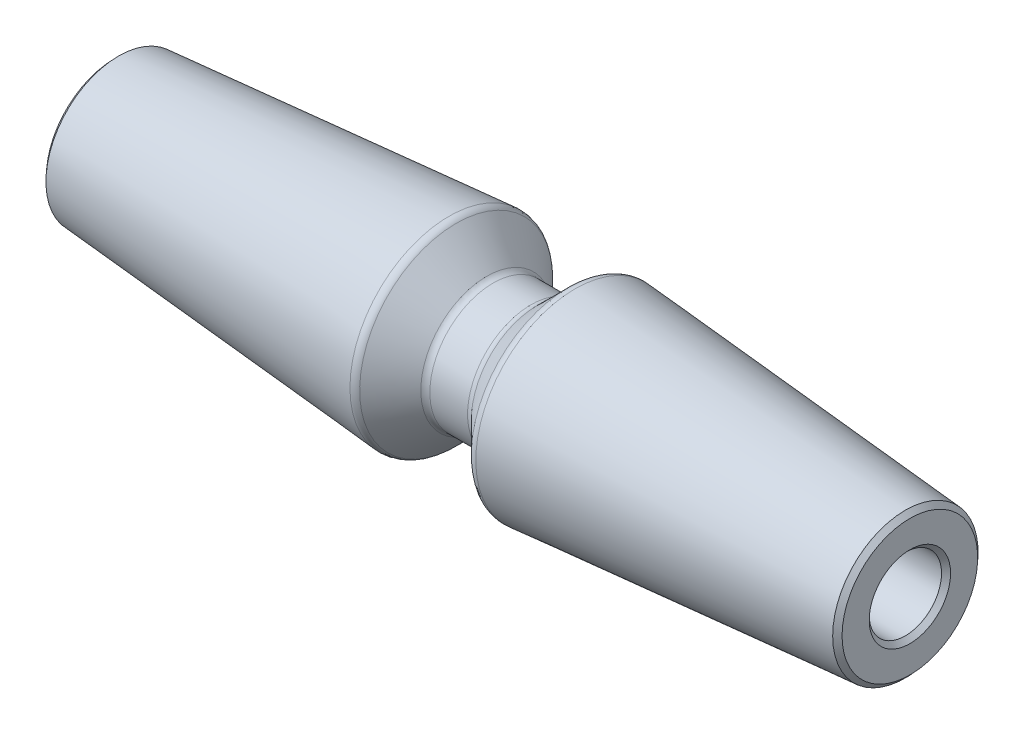
ISO-10303-21;
HEADER;
FILE_DESCRIPTION(('STEP AP214'),'2;1');
FILE_NAME('part.step','',(''),(''),'','','');
FILE_SCHEMA(('AUTOMOTIVE_DESIGN { 1 0 10303 214 1 1 1 1 }'));
ENDSEC;
DATA;
#1=APPLICATION_CONTEXT('core data for automotive mechanical design processes');
#2=APPLICATION_PROTOCOL_DEFINITION('international standard','automotive_design',2000,#1);
#3=PRODUCT_CONTEXT('',#1,'mechanical');
#4=PRODUCT('Part','Part','',(#3));
#5=PRODUCT_RELATED_PRODUCT_CATEGORY('part','',(#4));
#6=PRODUCT_DEFINITION_FORMATION('','',#4);
#7=PRODUCT_DEFINITION_CONTEXT('part definition',#1,'design');
#8=PRODUCT_DEFINITION('design','',#6,#7);
#9=PRODUCT_DEFINITION_SHAPE('','',#8);
#10=(LENGTH_UNIT() NAMED_UNIT(*) SI_UNIT(.MILLI.,.METRE.));
#11=(NAMED_UNIT(*) PLANE_ANGLE_UNIT() SI_UNIT($,.RADIAN.));
#12=(NAMED_UNIT(*) SI_UNIT($,.STERADIAN.) SOLID_ANGLE_UNIT());
#13=UNCERTAINTY_MEASURE_WITH_UNIT(LENGTH_MEASURE(1.E-05),#10,'distance_accuracy_value','');
#14=(GEOMETRIC_REPRESENTATION_CONTEXT(3) GLOBAL_UNCERTAINTY_ASSIGNED_CONTEXT((#13)) GLOBAL_UNIT_ASSIGNED_CONTEXT((#10,
#11,#12)) REPRESENTATION_CONTEXT('',''));
#15=CARTESIAN_POINT('',(0.,0.,0.));
#16=DIRECTION('',(0.,0.,1.));
#17=DIRECTION('',(1.,0.,0.));
#18=AXIS2_PLACEMENT_3D('',#15,#16,#17);
#19=CARTESIAN_POINT('',(-13.,6.,0.));
#20=DIRECTION('',(-1.,0.,0.));
#21=DIRECTION('',(0.,0.,1.));
#22=AXIS2_PLACEMENT_3D('',#19,#20,#21);
#23=PLANE('',#22);
#24=CARTESIAN_POINT('',(-13.0000000002042,0.,0.));
#25=DIRECTION('',(-1.,0.,0.));
#26=DIRECTION('',(0.,0.,1.));
#27=AXIS2_PLACEMENT_3D('',#24,#25,#26);
#28=CIRCLE('',#27,4.49999999972306);
#29=CARTESIAN_POINT('',(-13.0000000002042,0.,4.49999999972306));
#30=VERTEX_POINT('',#29);
#31=EDGE_CURVE('E132',#30,#30,#28,.F.);
#32=ORIENTED_EDGE('',*,*,#31,.T.);
#33=EDGE_LOOP('',(#32));
#34=FACE_BOUND('',#33,.T.);
#35=CARTESIAN_POINT('',(-13.0000000002546,0.,0.));
#36=DIRECTION('',(1.,0.,0.));
#37=DIRECTION('',(0.,1.,0.));
#38=AXIS2_PLACEMENT_3D('',#35,#36,#37);
#39=CIRCLE('',#38,7.50000000023502);
#40=CARTESIAN_POINT('',(-13.0000000002546,7.50000000023502,0.));
#41=VERTEX_POINT('',#40);
#42=EDGE_CURVE('E18',#41,#41,#39,.T.);
#43=ORIENTED_EDGE('',*,*,#42,.F.);
#44=EDGE_LOOP('',(#43));
#45=FACE_BOUND('',#44,.T.);
#46=ADVANCED_FACE('F15',(#34,#45),#23,.T.);
#47=CARTESIAN_POINT('',(-12.5015923604774,0.,0.));
#48=DIRECTION('',(1.,0.,0.));
#49=DIRECTION('',(0.,1.,0.));
#50=AXIS2_PLACEMENT_3D('',#47,#48,#49);
#51=CONICAL_SURFACE('',#50,8.03987261090644,0.825313155310512);
#52=CARTESIAN_POINT('',(-12.5015923608634,0.,0.));
#53=DIRECTION('',(1.,0.,0.));
#54=DIRECTION('',(0.,1.,0.));
#55=AXIS2_PLACEMENT_3D('',#52,#53,#54);
#56=CIRCLE('',#55,8.03987261278535);
#57=CARTESIAN_POINT('',(-12.5015923608634,8.03987261278534,0.));
#58=VERTEX_POINT('',#57);
#59=EDGE_CURVE('E127',#58,#58,#56,.T.);
#60=ORIENTED_EDGE('',*,*,#59,.F.);
#61=EDGE_LOOP('',(#60));
#62=FACE_BOUND('',#61,.T.);
#63=ORIENTED_EDGE('',*,*,#42,.T.);
#64=EDGE_LOOP('',(#63));
#65=FACE_BOUND('',#64,.T.);
#66=ADVANCED_FACE('F156',(#62,#65),#51,.T.);
#67=CARTESIAN_POINT('',(-13.0000000001473,0.,0.));
#68=DIRECTION('',(-1.,0.,0.));
#69=DIRECTION('',(0.,0.,1.));
#70=AXIS2_PLACEMENT_3D('',#67,#68,#69);
#71=CONICAL_SURFACE('',#70,4.49999999966621,0.785398162487954);
#72=ORIENTED_EDGE('',*,*,#31,.F.);
#73=EDGE_LOOP('',(#72));
#74=FACE_BOUND('',#73,.T.);
#75=CARTESIAN_POINT('',(-12.5,0.,0.));
#76=DIRECTION('',(1.,0.,0.));
#77=DIRECTION('',(0.,1.,0.));
#78=AXIS2_PLACEMENT_3D('',#75,#76,#77);
#79=CIRCLE('',#78,4.);
#80=CARTESIAN_POINT('',(-12.5,4.,0.));
#81=VERTEX_POINT('',#80);
#82=EDGE_CURVE('E122',#81,#81,#79,.T.);
#83=ORIENTED_EDGE('',*,*,#82,.T.);
#84=EDGE_LOOP('',(#83));
#85=FACE_BOUND('',#84,.T.);
#86=ADVANCED_FACE('F163',(#74,#85),#71,.F.);
#87=CARTESIAN_POINT('',(24.0396819389131,0.,0.));
#88=DIRECTION('',(1.,0.,0.));
#89=DIRECTION('',(0.,0.,-1.));
#90=AXIS2_PLACEMENT_3D('',#87,#88,#89);
#91=CONICAL_SURFACE('',#90,10.9631745534129,0.0798299856210183);
#92=ORIENTED_EDGE('',*,*,#59,.T.);
#93=EDGE_LOOP('',(#92));
#94=FACE_BOUND('',#93,.T.);
#95=CARTESIAN_POINT('',(24.0396819387779,0.,0.));
#96=DIRECTION('',(1.,0.,0.));
#97=DIRECTION('',(0.,0.,-1.));
#98=AXIS2_PLACEMENT_3D('',#95,#96,#97);
#99=CIRCLE('',#98,10.9631745551022);
#100=CARTESIAN_POINT('',(24.0396819387779,0.,-10.9631745551022));
#101=VERTEX_POINT('',#100);
#102=EDGE_CURVE('E118',#101,#101,#99,.T.);
#103=ORIENTED_EDGE('',*,*,#102,.F.);
#104=EDGE_LOOP('',(#103));
#105=FACE_BOUND('',#104,.T.);
#106=ADVANCED_FACE('F246',(#94,#105),#91,.T.);
#107=CARTESIAN_POINT('',(-8.,0.,0.));
#108=DIRECTION('',(1.,0.,0.));
#109=DIRECTION('',(0.,1.,0.));
#110=AXIS2_PLACEMENT_3D('',#107,#108,#109);
#111=CYLINDRICAL_SURFACE('',#110,4.);
#112=ORIENTED_EDGE('',*,*,#82,.F.);
#113=EDGE_LOOP('',(#112));
#114=FACE_BOUND('',#113,.T.);
#115=CARTESIAN_POINT('',(-3.,0.,0.));
#116=DIRECTION('',(1.,0.,0.));
#117=DIRECTION('',(0.,1.,0.));
#118=AXIS2_PLACEMENT_3D('',#115,#116,#117);
#119=CIRCLE('',#118,4.);
#120=CARTESIAN_POINT('',(-3.,4.,0.));
#121=VERTEX_POINT('',#120);
#122=EDGE_CURVE('E121',#121,#121,#119,.F.);
#123=ORIENTED_EDGE('',*,*,#122,.F.);
#124=EDGE_LOOP('',(#123));
#125=FACE_BOUND('',#124,.T.);
#126=ADVANCED_FACE('F110',(#114,#125),#111,.F.);
#127=CARTESIAN_POINT('',(24.1194271610608,0.,0.));
#128=DIRECTION('',(1.,0.,0.));
#129=DIRECTION('',(0.,0.,-1.));
#130=AXIS2_PLACEMENT_3D('',#127,#128,#129);
#131=TOROIDAL_SURFACE('',#130,9.96635927656611,1.);
#132=ORIENTED_EDGE('',*,*,#102,.T.);
#133=EDGE_LOOP('',(#132));
#134=FACE_BOUND('',#133,.T.);
#135=CARTESIAN_POINT('',(24.8265339407304,0.,0.));
#136=DIRECTION('',(-1.,0.,0.));
#137=DIRECTION('',(0.,1.,0.));
#138=AXIS2_PLACEMENT_3D('',#135,#136,#137);
#139=CIRCLE('',#138,10.6734660562357);
#140=CARTESIAN_POINT('',(24.8265339407304,10.6734660562357,0.));
#141=VERTEX_POINT('',#140);
#142=EDGE_CURVE('E148',#141,#141,#139,.F.);
#143=ORIENTED_EDGE('',*,*,#142,.F.);
#144=EDGE_LOOP('',(#143));
#145=FACE_BOUND('',#144,.T.);
#146=ADVANCED_FACE('F105',(#134,#145),#131,.T.);
#147=CARTESIAN_POINT('',(-3.,3.75,0.));
#148=DIRECTION('',(-1.,0.,0.));
#149=DIRECTION('',(0.,0.,1.));
#150=AXIS2_PLACEMENT_3D('',#147,#148,#149);
#151=PLANE('',#150);
#152=CARTESIAN_POINT('',(-3.,0.,0.));
#153=DIRECTION('',(1.,0.,0.));
#154=DIRECTION('',(0.,1.,0.));
#155=AXIS2_PLACEMENT_3D('',#152,#153,#154);
#156=CIRCLE('',#155,3.5);
#157=CARTESIAN_POINT('',(-3.,3.5,0.));
#158=VERTEX_POINT('',#157);
#159=EDGE_CURVE('E145',#158,#158,#156,.T.);
#160=ORIENTED_EDGE('',*,*,#159,.T.);
#161=EDGE_LOOP('',(#160));
#162=FACE_BOUND('',#161,.T.);
#163=ORIENTED_EDGE('',*,*,#122,.T.);
#164=EDGE_LOOP('',(#163));
#165=FACE_BOUND('',#164,.T.);
#166=ADVANCED_FACE('F101',(#162,#165),#151,.T.);
#167=CARTESIAN_POINT('',(24.8265339407304,0.,0.));
#168=DIRECTION('',(-1.,0.,0.));
#169=DIRECTION('',(0.,0.,1.));
#170=AXIS2_PLACEMENT_3D('',#167,#168,#169);
#171=CONICAL_SURFACE('',#170,10.6734660562357,0.785398162500001);
#172=ORIENTED_EDGE('',*,*,#142,.T.);
#173=EDGE_LOOP('',(#172));
#174=FACE_BOUND('',#173,.T.);
#175=CARTESIAN_POINT('',(28.2071067811865,0.,0.));
#176=DIRECTION('',(1.,0.,0.));
#177=DIRECTION('',(0.,0.,-1.));
#178=AXIS2_PLACEMENT_3D('',#175,#176,#177);
#179=CIRCLE('',#178,7.29289321881346);
#180=CARTESIAN_POINT('',(28.2071067811865,0.,-7.29289321881346));
#181=VERTEX_POINT('',#180);
#182=EDGE_CURVE('E85',#181,#181,#179,.F.);
#183=ORIENTED_EDGE('',*,*,#182,.T.);
#184=EDGE_LOOP('',(#183));
#185=FACE_BOUND('',#184,.T.);
#186=ADVANCED_FACE('F97',(#174,#185),#171,.T.);
#187=CARTESIAN_POINT('',(31.,0.,0.));
#188=DIRECTION('',(1.,0.,0.));
#189=DIRECTION('',(0.,1.,0.));
#190=AXIS2_PLACEMENT_3D('',#187,#188,#189);
#191=CYLINDRICAL_SURFACE('',#190,3.5);
#192=CARTESIAN_POINT('',(65.,0.,0.));
#193=DIRECTION('',(1.,0.,0.));
#194=DIRECTION('',(0.,1.,0.));
#195=AXIS2_PLACEMENT_3D('',#192,#193,#194);
#196=CIRCLE('',#195,3.5);
#197=CARTESIAN_POINT('',(65.,3.5,0.));
#198=VERTEX_POINT('',#197);
#199=EDGE_CURVE('E80',#198,#198,#196,.F.);
#200=ORIENTED_EDGE('',*,*,#199,.F.);
#201=EDGE_LOOP('',(#200));
#202=FACE_BOUND('',#201,.T.);
#203=ORIENTED_EDGE('',*,*,#159,.F.);
#204=EDGE_LOOP('',(#203));
#205=FACE_BOUND('',#204,.T.);
#206=ADVANCED_FACE('F93',(#202,#205),#191,.F.);
#207=CARTESIAN_POINT('',(28.9142135623731,0.,0.));
#208=DIRECTION('',(1.,0.,0.));
#209=DIRECTION('',(0.,0.,-1.));
#210=AXIS2_PLACEMENT_3D('',#207,#208,#209);
#211=TOROIDAL_SURFACE('',#210,8.,0.999999999999998);
#212=ORIENTED_EDGE('',*,*,#182,.F.);
#213=EDGE_LOOP('',(#212));
#214=FACE_BOUND('',#213,.T.);
#215=CARTESIAN_POINT('',(28.9142135623731,0.,0.));
#216=DIRECTION('',(1.,0.,0.));
#217=DIRECTION('',(0.,1.,0.));
#218=AXIS2_PLACEMENT_3D('',#215,#216,#217);
#219=CIRCLE('',#218,7.);
#220=CARTESIAN_POINT('',(28.9142135623731,7.,0.));
#221=VERTEX_POINT('',#220);
#222=EDGE_CURVE('E77',#221,#221,#219,.T.);
#223=ORIENTED_EDGE('',*,*,#222,.F.);
#224=EDGE_LOOP('',(#223));
#225=FACE_BOUND('',#224,.T.);
#226=ADVANCED_FACE('F88',(#214,#225),#211,.F.);
#227=CARTESIAN_POINT('',(65.,3.75,0.));
#228=DIRECTION('',(1.,0.,0.));
#229=DIRECTION('',(0.,0.,-1.));
#230=AXIS2_PLACEMENT_3D('',#227,#228,#229);
#231=PLANE('',#230);
#232=ORIENTED_EDGE('',*,*,#199,.T.);
#233=EDGE_LOOP('',(#232));
#234=FACE_BOUND('',#233,.T.);
#235=CARTESIAN_POINT('',(65.,0.,0.));
#236=DIRECTION('',(1.,0.,0.));
#237=DIRECTION('',(0.,1.,0.));
#238=AXIS2_PLACEMENT_3D('',#235,#236,#237);
#239=CIRCLE('',#238,4.);
#240=CARTESIAN_POINT('',(65.,4.,0.));
#241=VERTEX_POINT('',#240);
#242=EDGE_CURVE('E74',#241,#241,#239,.T.);
#243=ORIENTED_EDGE('',*,*,#242,.T.);
#244=EDGE_LOOP('',(#243));
#245=FACE_BOUND('',#244,.T.);
#246=ADVANCED_FACE('F92',(#234,#245),#231,.T.);
#247=CARTESIAN_POINT('',(31.,0.,0.));
#248=DIRECTION('',(1.,0.,0.));
#249=DIRECTION('',(0.,1.,0.));
#250=AXIS2_PLACEMENT_3D('',#247,#248,#249);
#251=CYLINDRICAL_SURFACE('',#250,7.);
#252=ORIENTED_EDGE('',*,*,#222,.T.);
#253=EDGE_LOOP('',(#252));
#254=FACE_BOUND('',#253,.T.);
#255=CARTESIAN_POINT('',(33.0857864376269,0.,0.));
#256=DIRECTION('',(1.,0.,0.));
#257=DIRECTION('',(0.,0.,-1.));
#258=AXIS2_PLACEMENT_3D('',#255,#256,#257);
#259=CIRCLE('',#258,7.);
#260=CARTESIAN_POINT('',(33.0857864376269,0.,-7.));
#261=VERTEX_POINT('',#260);
#262=EDGE_CURVE('E70',#261,#261,#259,.F.);
#263=ORIENTED_EDGE('',*,*,#262,.T.);
#264=EDGE_LOOP('',(#263));
#265=FACE_BOUND('',#264,.T.);
#266=ADVANCED_FACE('F207',(#254,#265),#251,.T.);
#267=CARTESIAN_POINT('',(70.,0.,0.));
#268=DIRECTION('',(1.,0.,0.));
#269=DIRECTION('',(0.,1.,0.));
#270=AXIS2_PLACEMENT_3D('',#267,#268,#269);
#271=CYLINDRICAL_SURFACE('',#270,4.);
#272=CARTESIAN_POINT('',(74.4999999997731,0.,0.));
#273=DIRECTION('',(1.,0.,0.));
#274=DIRECTION('',(0.,-1.,0.));
#275=AXIS2_PLACEMENT_3D('',#272,#273,#274);
#276=CIRCLE('',#275,4.00000000024647);
#277=CARTESIAN_POINT('',(74.4999999997731,-4.00000000024647,0.));
#278=VERTEX_POINT('',#277);
#279=EDGE_CURVE('E73',#278,#278,#276,.T.);
#280=ORIENTED_EDGE('',*,*,#279,.T.);
#281=EDGE_LOOP('',(#280));
#282=FACE_BOUND('',#281,.T.);
#283=ORIENTED_EDGE('',*,*,#242,.F.);
#284=EDGE_LOOP('',(#283));
#285=FACE_BOUND('',#284,.T.);
#286=ADVANCED_FACE('F62',(#282,#285),#271,.F.);
#287=CARTESIAN_POINT('',(33.0857864376269,0.,0.));
#288=DIRECTION('',(1.,0.,0.));
#289=DIRECTION('',(0.,0.,-1.));
#290=AXIS2_PLACEMENT_3D('',#287,#288,#289);
#291=TOROIDAL_SURFACE('',#290,8.,0.999999999999998);
#292=ORIENTED_EDGE('',*,*,#262,.F.);
#293=EDGE_LOOP('',(#292));
#294=FACE_BOUND('',#293,.T.);
#295=CARTESIAN_POINT('',(33.7928932172965,0.,0.));
#296=DIRECTION('',(1.,0.,0.));
#297=DIRECTION('',(0.,1.,0.));
#298=AXIS2_PLACEMENT_3D('',#295,#296,#297);
#299=CIRCLE('',#298,7.2928932203304);
#300=CARTESIAN_POINT('',(33.7928932172965,7.2928932203304,0.));
#301=VERTEX_POINT('',#300);
#302=EDGE_CURVE('E140',#301,#301,#299,.T.);
#303=ORIENTED_EDGE('',*,*,#302,.F.);
#304=EDGE_LOOP('',(#303));
#305=FACE_BOUND('',#304,.T.);
#306=ADVANCED_FACE('F57',(#294,#305),#291,.F.);
#307=CARTESIAN_POINT('',(75.0000000001592,0.,0.));
#308=DIRECTION('',(1.,0.,0.));
#309=DIRECTION('',(0.,0.,-1.));
#310=AXIS2_PLACEMENT_3D('',#307,#308,#309);
#311=CONICAL_SURFACE('',#310,4.49999999972306,0.785398162487954);
#312=ORIENTED_EDGE('',*,*,#279,.F.);
#313=EDGE_LOOP('',(#312));
#314=FACE_BOUND('',#313,.T.);
#315=CARTESIAN_POINT('',(75.000000000216,0.,0.));
#316=DIRECTION('',(1.,0.,0.));
#317=DIRECTION('',(0.,0.,-1.));
#318=AXIS2_PLACEMENT_3D('',#315,#316,#317);
#319=CIRCLE('',#318,4.4999999997799);
#320=CARTESIAN_POINT('',(75.000000000216,0.,-4.4999999997799));
#321=VERTEX_POINT('',#320);
#322=EDGE_CURVE('E137',#321,#321,#319,.F.);
#323=ORIENTED_EDGE('',*,*,#322,.F.);
#324=EDGE_LOOP('',(#323));
#325=FACE_BOUND('',#324,.T.);
#326=ADVANCED_FACE('F53',(#314,#325),#311,.F.);
#327=CARTESIAN_POINT('',(37.1734660592696,0.,0.));
#328=DIRECTION('',(1.,0.,0.));
#329=DIRECTION('',(0.,0.,-1.));
#330=AXIS2_PLACEMENT_3D('',#327,#328,#329);
#331=CONICAL_SURFACE('',#330,10.6734660562357,0.785398162500002);
#332=ORIENTED_EDGE('',*,*,#302,.T.);
#333=EDGE_LOOP('',(#332));
#334=FACE_BOUND('',#333,.T.);
#335=CARTESIAN_POINT('',(37.1734660577527,0.,0.));
#336=DIRECTION('',(1.,0.,0.));
#337=DIRECTION('',(0.,0.,-1.));
#338=AXIS2_PLACEMENT_3D('',#335,#336,#337);
#339=CIRCLE('',#338,10.6734660577527);
#340=CARTESIAN_POINT('',(37.1734660577527,0.,-10.6734660577527));
#341=VERTEX_POINT('',#340);
#342=EDGE_CURVE('E36',#341,#341,#339,.T.);
#343=ORIENTED_EDGE('',*,*,#342,.F.);
#344=EDGE_LOOP('',(#343));
#345=FACE_BOUND('',#344,.T.);
#346=ADVANCED_FACE('F49',(#334,#345),#331,.T.);
#347=CARTESIAN_POINT('',(75.,6.,0.));
#348=DIRECTION('',(1.,0.,0.));
#349=DIRECTION('',(0.,0.,-1.));
#350=AXIS2_PLACEMENT_3D('',#347,#348,#349);
#351=PLANE('',#350);
#352=ORIENTED_EDGE('',*,*,#322,.T.);
#353=EDGE_LOOP('',(#352));
#354=FACE_BOUND('',#353,.T.);
#355=CARTESIAN_POINT('',(75.0000000002546,0.,0.));
#356=DIRECTION('',(-1.,0.,0.));
#357=DIRECTION('',(0.,0.,1.));
#358=AXIS2_PLACEMENT_3D('',#355,#356,#357);
#359=CIRCLE('',#358,7.50000000023502);
#360=CARTESIAN_POINT('',(75.0000000002546,0.,7.50000000023502));
#361=VERTEX_POINT('',#360);
#362=EDGE_CURVE('E27',#361,#361,#359,.T.);
#363=ORIENTED_EDGE('',*,*,#362,.F.);
#364=EDGE_LOOP('',(#363));
#365=FACE_BOUND('',#364,.T.);
#366=ADVANCED_FACE('F44',(#354,#365),#351,.T.);
#367=CARTESIAN_POINT('',(37.8805728389392,0.,0.));
#368=DIRECTION('',(1.,0.,0.));
#369=DIRECTION('',(0.,0.,-1.));
#370=AXIS2_PLACEMENT_3D('',#367,#368,#369);
#371=TOROIDAL_SURFACE('',#370,9.96635927656611,1.);
#372=ORIENTED_EDGE('',*,*,#342,.T.);
#373=EDGE_LOOP('',(#372));
#374=FACE_BOUND('',#373,.T.);
#375=CARTESIAN_POINT('',(37.9603180610869,0.,0.));
#376=DIRECTION('',(-1.,0.,0.));
#377=DIRECTION('',(0.,1.,0.));
#378=AXIS2_PLACEMENT_3D('',#375,#376,#377);
#379=CIRCLE('',#378,10.9631745534129);
#380=CARTESIAN_POINT('',(37.9603180610869,10.9631745534129,0.));
#381=VERTEX_POINT('',#380);
#382=EDGE_CURVE('E22',#381,#381,#379,.F.);
#383=ORIENTED_EDGE('',*,*,#382,.F.);
#384=EDGE_LOOP('',(#383));
#385=FACE_BOUND('',#384,.T.);
#386=ADVANCED_FACE('F39',(#374,#385),#371,.T.);
#387=CARTESIAN_POINT('',(74.5015923604774,0.,0.));
#388=DIRECTION('',(-1.,0.,0.));
#389=DIRECTION('',(0.,0.,1.));
#390=AXIS2_PLACEMENT_3D('',#387,#388,#389);
#391=CONICAL_SURFACE('',#390,8.03987261090645,0.825313155310521);
#392=ORIENTED_EDGE('',*,*,#362,.T.);
#393=EDGE_LOOP('',(#392));
#394=FACE_BOUND('',#393,.T.);
#395=CARTESIAN_POINT('',(74.5015923608635,0.,0.));
#396=DIRECTION('',(-1.,0.,0.));
#397=DIRECTION('',(0.,1.,0.));
#398=AXIS2_PLACEMENT_3D('',#395,#396,#397);
#399=CIRCLE('',#398,8.03987261278534);
#400=CARTESIAN_POINT('',(74.5015923608635,8.03987261278534,0.));
#401=VERTEX_POINT('',#400);
#402=EDGE_CURVE('E10',#401,#401,#399,.T.);
#403=ORIENTED_EDGE('',*,*,#402,.F.);
#404=EDGE_LOOP('',(#403));
#405=FACE_BOUND('',#404,.T.);
#406=ADVANCED_FACE('F43',(#394,#405),#391,.T.);
#407=CARTESIAN_POINT('',(37.9603180610869,0.,0.));
#408=DIRECTION('',(-1.,0.,0.));
#409=DIRECTION('',(0.,0.,1.));
#410=AXIS2_PLACEMENT_3D('',#407,#408,#409);
#411=CONICAL_SURFACE('',#410,10.9631745534129,0.0798299856210183);
#412=ORIENTED_EDGE('',*,*,#402,.T.);
#413=EDGE_LOOP('',(#412));
#414=FACE_BOUND('',#413,.T.);
#415=ORIENTED_EDGE('',*,*,#382,.T.);
#416=EDGE_LOOP('',(#415));
#417=FACE_BOUND('',#416,.T.);
#418=ADVANCED_FACE('F165',(#414,#417),#411,.T.);
#419=CLOSED_SHELL('',(#46,#66,#86,#106,#126,#146,#166,#186,#206,#226,#246,#266,#286,#306,#326,
#346,#366,#386,#406,#418));
#420=MANIFOLD_SOLID_BREP('B1',#419);
#421=ADVANCED_BREP_SHAPE_REPRESENTATION('',(#18,#420),#14);
#422=SHAPE_DEFINITION_REPRESENTATION(#9,#421);
ENDSEC;
END-ISO-10303-21;
